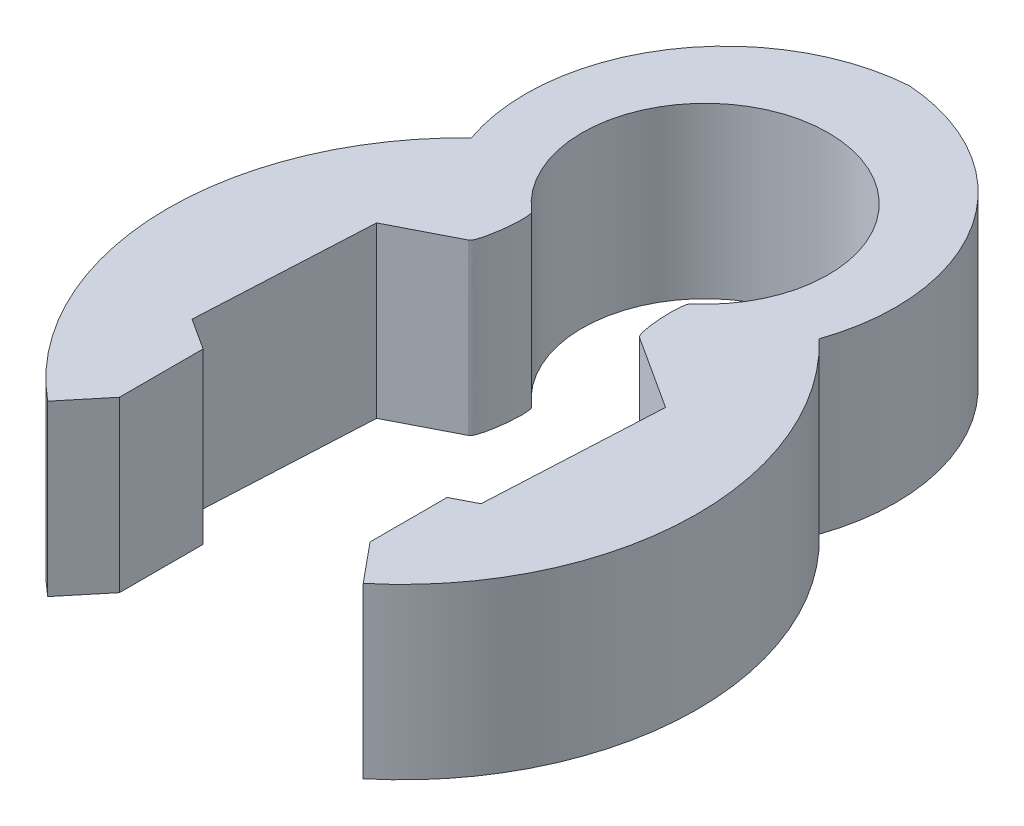
ISO-10303-21;
HEADER;
FILE_DESCRIPTION(('STEP AP214'),'2;1');
FILE_NAME('part.step','',(''),(''),'','','');
FILE_SCHEMA(('AUTOMOTIVE_DESIGN { 1 0 10303 214 1 1 1 1 }'));
ENDSEC;
DATA;
#1=APPLICATION_CONTEXT('core data for automotive mechanical design processes');
#2=APPLICATION_PROTOCOL_DEFINITION('international standard','automotive_design',2000,#1);
#3=PRODUCT_CONTEXT('',#1,'mechanical');
#4=PRODUCT('Part','Part','',(#3));
#5=PRODUCT_RELATED_PRODUCT_CATEGORY('part','',(#4));
#6=PRODUCT_DEFINITION_FORMATION('','',#4);
#7=PRODUCT_DEFINITION_CONTEXT('part definition',#1,'design');
#8=PRODUCT_DEFINITION('design','',#6,#7);
#9=PRODUCT_DEFINITION_SHAPE('','',#8);
#10=(LENGTH_UNIT() NAMED_UNIT(*) SI_UNIT(.MILLI.,.METRE.));
#11=(NAMED_UNIT(*) PLANE_ANGLE_UNIT() SI_UNIT($,.RADIAN.));
#12=(NAMED_UNIT(*) SI_UNIT($,.STERADIAN.) SOLID_ANGLE_UNIT());
#13=UNCERTAINTY_MEASURE_WITH_UNIT(LENGTH_MEASURE(1.E-05),#10,'distance_accuracy_value','');
#14=(GEOMETRIC_REPRESENTATION_CONTEXT(3) GLOBAL_UNCERTAINTY_ASSIGNED_CONTEXT((#13)) GLOBAL_UNIT_ASSIGNED_CONTEXT((#10,
#11,#12)) REPRESENTATION_CONTEXT('',''));
#15=CARTESIAN_POINT('',(0.,0.,0.));
#16=DIRECTION('',(0.,0.,1.));
#17=DIRECTION('',(1.,0.,0.));
#18=AXIS2_PLACEMENT_3D('',#15,#16,#17);
#19=CARTESIAN_POINT('',(-0.598376770378096,6.35,0.494644047014797));
#20=DIRECTION('',(0.770751226655631,0.,-0.637136207265636));
#21=DIRECTION('',(-0.637136207265636,0.,-0.770751226655631));
#22=AXIS2_PLACEMENT_3D('',#19,#20,#21);
#23=PLANE('',#22);
#24=DIRECTION('',(0.637136207265636,0.,0.770751226655631));
#25=VECTOR('',#24,1.);
#26=CARTESIAN_POINT('',(-0.598376770378096,0.,0.494644047014797));
#27=LINE('',#26,#25);
#28=CARTESIAN_POINT('',(4.70120496832042,0.,6.90561093177807));
#29=VERTEX_POINT('',#28);
#30=CARTESIAN_POINT('',(5.9187802535043,0.,8.37852619526394));
#31=VERTEX_POINT('',#30);
#32=EDGE_CURVE('E196',#29,#31,#27,.T.);
#33=ORIENTED_EDGE('',*,*,#32,.T.);
#34=DIRECTION('',(0.,-1.,0.));
#35=VECTOR('',#34,1.);
#36=CARTESIAN_POINT('',(5.9187802535043,6.35,8.37852619526394));
#37=LINE('',#36,#35);
#38=CARTESIAN_POINT('',(5.9187802535043,6.35,8.37852619526394));
#39=VERTEX_POINT('',#38);
#40=EDGE_CURVE('E177',#39,#31,#37,.T.);
#41=ORIENTED_EDGE('',*,*,#40,.F.);
#42=DIRECTION('',(0.637136207265636,0.,0.770751226655631));
#43=VECTOR('',#42,1.);
#44=CARTESIAN_POINT('',(-0.598376770378096,6.35,0.494644047014797));
#45=LINE('',#44,#43);
#46=CARTESIAN_POINT('',(4.70120496832042,6.35,6.90561093177807));
#47=VERTEX_POINT('',#46);
#48=EDGE_CURVE('E183',#47,#39,#45,.T.);
#49=ORIENTED_EDGE('',*,*,#48,.F.);
#50=DIRECTION('',(0.,-1.,0.));
#51=VECTOR('',#50,1.);
#52=CARTESIAN_POINT('',(4.70120496832042,6.35,6.90561093177807));
#53=LINE('',#52,#51);
#54=EDGE_CURVE('E225',#47,#29,#53,.T.);
#55=ORIENTED_EDGE('',*,*,#54,.T.);
#56=EDGE_LOOP('',(#33,#41,#49,#55));
#57=FACE_BOUND('',#56,.T.);
#58=ADVANCED_FACE('F46',(#57),#23,.F.);
#59=CARTESIAN_POINT('',(-1.12456517035275,6.35,-0.141892301269298));
#60=DIRECTION('',(0.,-1.,0.));
#61=DIRECTION('',(0.,0.,-1.));
#62=AXIS2_PLACEMENT_3D('',#59,#60,#61);
#63=CYLINDRICAL_SURFACE('',#62,11.0546933976404);
#64=CARTESIAN_POINT('',(-1.12456517035275,0.,-0.141892301269298));
#65=DIRECTION('',(0.,1.,0.));
#66=DIRECTION('',(0.,0.,1.));
#67=AXIS2_PLACEMENT_3D('',#64,#65,#66);
#68=CIRCLE('',#67,11.0546933976404);
#69=CARTESIAN_POINT('',(6.52662469768185,0.,-8.12096115165017));
#70=VERTEX_POINT('',#69);
#71=EDGE_CURVE('E261',#31,#70,#68,.T.);
#72=ORIENTED_EDGE('',*,*,#71,.T.);
#73=DIRECTION('',(0.,-1.,0.));
#74=VECTOR('',#73,1.);
#75=CARTESIAN_POINT('',(6.52662469768185,6.35,-8.12096115165017));
#76=LINE('',#75,#74);
#77=CARTESIAN_POINT('',(6.52662469768185,6.35,-8.12096115165017));
#78=VERTEX_POINT('',#77);
#79=EDGE_CURVE('E180',#78,#70,#76,.T.);
#80=ORIENTED_EDGE('',*,*,#79,.F.);
#81=CARTESIAN_POINT('',(-1.12456517035275,6.35,-0.141892301269298));
#82=DIRECTION('',(0.,1.,0.));
#83=DIRECTION('',(0.,0.,1.));
#84=AXIS2_PLACEMENT_3D('',#81,#82,#83);
#85=CIRCLE('',#84,11.0546933976404);
#86=EDGE_CURVE('E173',#39,#78,#85,.T.);
#87=ORIENTED_EDGE('',*,*,#86,.F.);
#88=ORIENTED_EDGE('',*,*,#40,.T.);
#89=EDGE_LOOP('',(#72,#80,#87,#88));
#90=FACE_BOUND('',#89,.T.);
#91=ADVANCED_FACE('F175',(#90),#63,.T.);
#92=CARTESIAN_POINT('',(-0.542547571953858,6.35,-10.5725213353697));
#93=DIRECTION('',(0.,-1.,0.));
#94=DIRECTION('',(0.,0.,-1.));
#95=AXIS2_PLACEMENT_3D('',#92,#93,#94);
#96=CYLINDRICAL_SURFACE('',#95,7.48220180910577);
#97=CARTESIAN_POINT('',(-0.542547571953858,0.,-10.5725213353697));
#98=DIRECTION('',(0.,1.,0.));
#99=DIRECTION('',(0.,0.,1.));
#100=AXIS2_PLACEMENT_3D('',#97,#98,#99);
#101=CIRCLE('',#100,7.48220180910577);
#102=CARTESIAN_POINT('',(0.,0.,-18.0350266817231));
#103=VERTEX_POINT('',#102);
#104=EDGE_CURVE('E258',#70,#103,#101,.T.);
#105=ORIENTED_EDGE('',*,*,#104,.T.);
#106=DIRECTION('',(0.,-1.,0.));
#107=VECTOR('',#106,1.);
#108=CARTESIAN_POINT('',(0.,6.35,-18.0350266817231));
#109=LINE('',#108,#107);
#110=CARTESIAN_POINT('',(0.,6.35,-18.0350266817231));
#111=VERTEX_POINT('',#110);
#112=EDGE_CURVE('E201',#111,#103,#109,.T.);
#113=ORIENTED_EDGE('',*,*,#112,.F.);
#114=CARTESIAN_POINT('',(-0.542547571953858,6.35,-10.5725213353697));
#115=DIRECTION('',(0.,1.,0.));
#116=DIRECTION('',(0.,0.,1.));
#117=AXIS2_PLACEMENT_3D('',#114,#115,#116);
#118=CIRCLE('',#117,7.48220180910577);
#119=EDGE_CURVE('E182',#78,#111,#118,.T.);
#120=ORIENTED_EDGE('',*,*,#119,.F.);
#121=ORIENTED_EDGE('',*,*,#79,.T.);
#122=EDGE_LOOP('',(#105,#113,#120,#121));
#123=FACE_BOUND('',#122,.T.);
#124=ADVANCED_FACE('F259',(#123),#96,.T.);
#125=CARTESIAN_POINT('',(0.542547571953858,6.35,-10.5725213353697));
#126=DIRECTION('',(0.,-1.,0.));
#127=DIRECTION('',(0.,0.,-1.));
#128=AXIS2_PLACEMENT_3D('',#125,#126,#127);
#129=CYLINDRICAL_SURFACE('',#128,7.48220180910577);
#130=CARTESIAN_POINT('',(0.542547571953858,0.,-10.5725213353697));
#131=DIRECTION('',(0.,1.,0.));
#132=DIRECTION('',(0.,0.,1.));
#133=AXIS2_PLACEMENT_3D('',#130,#131,#132);
#134=CIRCLE('',#133,7.48220180910577);
#135=CARTESIAN_POINT('',(-6.52662469768186,0.,-8.12096115165017));
#136=VERTEX_POINT('',#135);
#137=EDGE_CURVE('E252',#136,#103,#134,.F.);
#138=ORIENTED_EDGE('',*,*,#137,.F.);
#139=DIRECTION('',(0.,-1.,0.));
#140=VECTOR('',#139,1.);
#141=CARTESIAN_POINT('',(-6.52662469768186,6.35,-8.12096115165017));
#142=LINE('',#141,#140);
#143=CARTESIAN_POINT('',(-6.52662469768186,6.35,-8.12096115165017));
#144=VERTEX_POINT('',#143);
#145=EDGE_CURVE('E244',#144,#136,#142,.T.);
#146=ORIENTED_EDGE('',*,*,#145,.F.);
#147=CARTESIAN_POINT('',(0.542547571953858,6.35,-10.5725213353697));
#148=DIRECTION('',(0.,1.,0.));
#149=DIRECTION('',(0.,0.,1.));
#150=AXIS2_PLACEMENT_3D('',#147,#148,#149);
#151=CIRCLE('',#150,7.48220180910577);
#152=EDGE_CURVE('E255',#144,#111,#151,.F.);
#153=ORIENTED_EDGE('',*,*,#152,.T.);
#154=ORIENTED_EDGE('',*,*,#112,.T.);
#155=EDGE_LOOP('',(#138,#146,#153,#154));
#156=FACE_BOUND('',#155,.T.);
#157=ADVANCED_FACE('F250',(#156),#129,.T.);
#158=CARTESIAN_POINT('',(1.12456517035275,6.35,-0.141892301269298));
#159=DIRECTION('',(0.,-1.,0.));
#160=DIRECTION('',(0.,0.,-1.));
#161=AXIS2_PLACEMENT_3D('',#158,#159,#160);
#162=CYLINDRICAL_SURFACE('',#161,11.0546933976404);
#163=CARTESIAN_POINT('',(1.12456517035275,0.,-0.141892301269298));
#164=DIRECTION('',(0.,1.,0.));
#165=DIRECTION('',(0.,0.,1.));
#166=AXIS2_PLACEMENT_3D('',#163,#164,#165);
#167=CIRCLE('',#166,11.0546933976404);
#168=CARTESIAN_POINT('',(-5.91878025350429,0.,8.37852619526395));
#169=VERTEX_POINT('',#168);
#170=EDGE_CURVE('E266',#169,#136,#167,.F.);
#171=ORIENTED_EDGE('',*,*,#170,.F.);
#172=DIRECTION('',(0.,-1.,0.));
#173=VECTOR('',#172,1.);
#174=CARTESIAN_POINT('',(-5.91878025350429,6.35,8.37852619526395));
#175=LINE('',#174,#173);
#176=CARTESIAN_POINT('',(-5.91878025350429,6.35,8.37852619526395));
#177=VERTEX_POINT('',#176);
#178=EDGE_CURVE('E242',#177,#169,#175,.T.);
#179=ORIENTED_EDGE('',*,*,#178,.F.);
#180=CARTESIAN_POINT('',(1.12456517035275,6.35,-0.141892301269298));
#181=DIRECTION('',(0.,1.,0.));
#182=DIRECTION('',(0.,0.,1.));
#183=AXIS2_PLACEMENT_3D('',#180,#181,#182);
#184=CIRCLE('',#183,11.0546933976404);
#185=EDGE_CURVE('E546',#177,#144,#184,.F.);
#186=ORIENTED_EDGE('',*,*,#185,.T.);
#187=ORIENTED_EDGE('',*,*,#145,.T.);
#188=EDGE_LOOP('',(#171,#179,#186,#187));
#189=FACE_BOUND('',#188,.T.);
#190=ADVANCED_FACE('F507',(#189),#162,.T.);
#191=CARTESIAN_POINT('',(0.598376770378092,6.35,0.494644047014792));
#192=DIRECTION('',(0.770751226655632,0.,0.637136207265635));
#193=DIRECTION('',(0.637136207265635,0.,-0.770751226655632));
#194=AXIS2_PLACEMENT_3D('',#191,#192,#193);
#195=PLANE('',#194);
#196=DIRECTION('',(-0.637136207265635,0.,0.770751226655632));
#197=VECTOR('',#196,1.);
#198=CARTESIAN_POINT('',(0.598376770378092,0.,0.494644047014792));
#199=LINE('',#198,#197);
#200=CARTESIAN_POINT('',(-4.70120496832041,0.,6.90561093177807));
#201=VERTEX_POINT('',#200);
#202=EDGE_CURVE('E268',#201,#169,#199,.T.);
#203=ORIENTED_EDGE('',*,*,#202,.F.);
#204=DIRECTION('',(0.,-1.,0.));
#205=VECTOR('',#204,1.);
#206=CARTESIAN_POINT('',(-4.70120496832041,6.35,6.90561093177807));
#207=LINE('',#206,#205);
#208=CARTESIAN_POINT('',(-4.70120496832041,6.35,6.90561093177807));
#209=VERTEX_POINT('',#208);
#210=EDGE_CURVE('E240',#209,#201,#207,.T.);
#211=ORIENTED_EDGE('',*,*,#210,.F.);
#212=DIRECTION('',(-0.637136207265635,0.,0.770751226655632));
#213=VECTOR('',#212,1.);
#214=CARTESIAN_POINT('',(0.598376770378092,6.35,0.494644047014792));
#215=LINE('',#214,#213);
#216=EDGE_CURVE('E543',#209,#177,#215,.T.);
#217=ORIENTED_EDGE('',*,*,#216,.T.);
#218=ORIENTED_EDGE('',*,*,#178,.T.);
#219=EDGE_LOOP('',(#203,#211,#217,#218));
#220=FACE_BOUND('',#219,.T.);
#221=ADVANCED_FACE('F510',(#220),#195,.T.);
#222=CARTESIAN_POINT('',(-4.70120496832042,6.35,0.));
#223=DIRECTION('',(1.,0.,0.));
#224=DIRECTION('',(0.,0.,-1.));
#225=AXIS2_PLACEMENT_3D('',#222,#223,#224);
#226=PLANE('',#225);
#227=DIRECTION('',(0.,0.,1.));
#228=VECTOR('',#227,1.);
#229=CARTESIAN_POINT('',(-4.70120496832042,0.,0.));
#230=LINE('',#229,#228);
#231=CARTESIAN_POINT('',(-4.70120496832042,0.,3.76579802688678));
#232=VERTEX_POINT('',#231);
#233=EDGE_CURVE('E273',#232,#201,#230,.T.);
#234=ORIENTED_EDGE('',*,*,#233,.F.);
#235=DIRECTION('',(0.,-1.,0.));
#236=VECTOR('',#235,1.);
#237=CARTESIAN_POINT('',(-4.70120496832042,6.35,3.76579802688678));
#238=LINE('',#237,#236);
#239=CARTESIAN_POINT('',(-4.70120496832042,6.35,3.76579802688678));
#240=VERTEX_POINT('',#239);
#241=EDGE_CURVE('E238',#240,#232,#238,.T.);
#242=ORIENTED_EDGE('',*,*,#241,.F.);
#243=DIRECTION('',(0.,0.,1.));
#244=VECTOR('',#243,1.);
#245=CARTESIAN_POINT('',(-4.70120496832042,6.35,0.));
#246=LINE('',#245,#244);
#247=EDGE_CURVE('E538',#240,#209,#246,.T.);
#248=ORIENTED_EDGE('',*,*,#247,.T.);
#249=ORIENTED_EDGE('',*,*,#210,.T.);
#250=EDGE_LOOP('',(#234,#242,#248,#249));
#251=FACE_BOUND('',#250,.T.);
#252=ADVANCED_FACE('F514',(#251),#226,.T.);
#253=CARTESIAN_POINT('',(-3.10319954031292,6.35,4.7991017506406));
#254=DIRECTION('',(0.542992045549067,0.,-0.839737839132214));
#255=DIRECTION('',(-0.839737839132214,0.,-0.542992045549067));
#256=AXIS2_PLACEMENT_3D('',#253,#254,#255);
#257=PLANE('',#256);
#258=DIRECTION('',(0.839737839132214,0.,0.542992045549067));
#259=VECTOR('',#258,1.);
#260=CARTESIAN_POINT('',(-3.10319954031292,0.,4.7991017506406));
#261=LINE('',#260,#259);
#262=CARTESIAN_POINT('',(-5.87396222791367,0.,3.00746866069182));
#263=VERTEX_POINT('',#262);
#264=EDGE_CURVE('E276',#263,#232,#261,.T.);
#265=ORIENTED_EDGE('',*,*,#264,.F.);
#266=DIRECTION('',(0.,-1.,0.));
#267=VECTOR('',#266,1.);
#268=CARTESIAN_POINT('',(-5.87396222791367,6.35,3.00746866069182));
#269=LINE('',#268,#267);
#270=CARTESIAN_POINT('',(-5.87396222791367,6.35,3.00746866069182));
#271=VERTEX_POINT('',#270);
#272=EDGE_CURVE('E236',#271,#263,#269,.T.);
#273=ORIENTED_EDGE('',*,*,#272,.F.);
#274=DIRECTION('',(0.839737839132214,0.,0.542992045549067));
#275=VECTOR('',#274,1.);
#276=CARTESIAN_POINT('',(-3.10319954031292,6.35,4.7991017506406));
#277=LINE('',#276,#275);
#278=EDGE_CURVE('E537',#271,#240,#277,.T.);
#279=ORIENTED_EDGE('',*,*,#278,.T.);
#280=ORIENTED_EDGE('',*,*,#241,.T.);
#281=EDGE_LOOP('',(#265,#273,#279,#280));
#282=FACE_BOUND('',#281,.T.);
#283=ADVANCED_FACE('F518',(#282),#257,.T.);
#284=CARTESIAN_POINT('',(-5.70774380155759,6.35,-0.287898759602873));
#285=DIRECTION('',(0.998730323982081,0.,0.0503759859322613));
#286=DIRECTION('',(0.0503759859322613,0.,-0.998730323982081));
#287=AXIS2_PLACEMENT_3D('',#284,#285,#286);
#288=PLANE('',#287);
#289=DIRECTION('',(-0.0503759859322613,0.,0.998730323982081));
#290=VECTOR('',#289,1.);
#291=CARTESIAN_POINT('',(-5.70774380155759,0.,-0.287898759602873));
#292=LINE('',#291,#290);
#293=CARTESIAN_POINT('',(-5.54152537520151,0.,-3.58326617989757));
#294=VERTEX_POINT('',#293);
#295=EDGE_CURVE('E279',#294,#263,#292,.T.);
#296=ORIENTED_EDGE('',*,*,#295,.F.);
#297=DIRECTION('',(0.,-1.,0.));
#298=VECTOR('',#297,1.);
#299=CARTESIAN_POINT('',(-5.54152537520151,6.35,-3.58326617989757));
#300=LINE('',#299,#298);
#301=CARTESIAN_POINT('',(-5.54152537520151,6.35,-3.58326617989757));
#302=VERTEX_POINT('',#301);
#303=EDGE_CURVE('E233',#302,#294,#300,.T.);
#304=ORIENTED_EDGE('',*,*,#303,.F.);
#305=DIRECTION('',(-0.0503759859322613,0.,0.998730323982081));
#306=VECTOR('',#305,1.);
#307=CARTESIAN_POINT('',(-5.70774380155759,6.35,-0.287898759602873));
#308=LINE('',#307,#306);
#309=EDGE_CURVE('E388',#302,#271,#308,.T.);
#310=ORIENTED_EDGE('',*,*,#309,.T.);
#311=ORIENTED_EDGE('',*,*,#272,.T.);
#312=EDGE_LOOP('',(#296,#304,#310,#311));
#313=FACE_BOUND('',#312,.T.);
#314=ADVANCED_FACE('F521',(#313),#288,.T.);
#315=CARTESIAN_POINT('',(-2.60454426124468,6.35,-5.08700051024348));
#316=DIRECTION('',(0.455738278433015,0.,0.890113825064476));
#317=DIRECTION('',(0.890113825064476,0.,-0.455738278433015));
#318=AXIS2_PLACEMENT_3D('',#315,#316,#317);
#319=PLANE('',#318);
#320=DIRECTION('',(-0.890113825064476,0.,0.455738278433015));
#321=VECTOR('',#320,1.);
#322=CARTESIAN_POINT('',(-2.60454426124468,0.,-5.08700051024348));
#323=LINE('',#322,#321);
#324=CARTESIAN_POINT('',(-3.24270927997033,0.,-4.76026002065594));
#325=VERTEX_POINT('',#324);
#326=EDGE_CURVE('E281',#325,#294,#323,.T.);
#327=ORIENTED_EDGE('',*,*,#326,.F.);
#328=CARTESIAN_POINT('',(-3.24270927997033,6.6675,-4.76026002065594));
#329=CARTESIAN_POINT('',(-3.24270927997033,4.33916666666666,-4.76026002065594));
#330=CARTESIAN_POINT('',(-3.24270927997033,2.01083333333333,-4.76026002065594));
#331=CARTESIAN_POINT('',(-3.24270927997033,-0.317499999999999,-4.76026002065594));
#332=(BOUNDED_CURVE() B_SPLINE_CURVE(3,(#328,#329,#330,#331),.UNSPECIFIED.,.F.,
.F.) B_SPLINE_CURVE_WITH_KNOTS((4,4),(-0.0003175,0.0066675),
.UNSPECIFIED.) CURVE() GEOMETRIC_REPRESENTATION_ITEM() RATIONAL_B_SPLINE_CURVE((1.,1.,1.,1.)) REPRESENTATION_ITEM(''));
#333=CARTESIAN_POINT('',(-3.24270927997033,6.35,-4.76026002065594));
#334=VERTEX_POINT('',#333);
#335=EDGE_CURVE('E12',#325,#334,#332,.F.);
#336=ORIENTED_EDGE('',*,*,#335,.T.);
#337=DIRECTION('',(-0.890113825064476,0.,0.455738278433015));
#338=VECTOR('',#337,1.);
#339=CARTESIAN_POINT('',(-2.60454426124468,6.35,-5.08700051024348));
#340=LINE('',#339,#338);
#341=EDGE_CURVE('E319',#334,#302,#340,.T.);
#342=ORIENTED_EDGE('',*,*,#341,.T.);
#343=ORIENTED_EDGE('',*,*,#303,.T.);
#344=EDGE_LOOP('',(#327,#336,#342,#343));
#345=FACE_BOUND('',#344,.T.);
#346=ADVANCED_FACE('F371',(#345),#319,.T.);
#347=CARTESIAN_POINT('',(0.,6.35,-10.3692276538807));
#348=DIRECTION('',(0.,-1.,0.));
#349=DIRECTION('',(0.,0.,-1.));
#350=AXIS2_PLACEMENT_3D('',#347,#348,#349);
#351=CYLINDRICAL_SURFACE('',#350,4.61735997238747);
#352=CARTESIAN_POINT('',(0.,0.,-10.3692276538807));
#353=DIRECTION('',(0.,1.,0.));
#354=DIRECTION('',(0.,0.,1.));
#355=AXIS2_PLACEMENT_3D('',#352,#353,#354);
#356=CIRCLE('',#355,4.61735997238747);
#357=CARTESIAN_POINT('',(2.97420564902517,0.,-6.83735649656018));
#358=VERTEX_POINT('',#357);
#359=CARTESIAN_POINT('',(-2.99713740518315,0.,-6.85679537851113));
#360=VERTEX_POINT('',#359);
#361=EDGE_CURVE('E210',#358,#360,#356,.T.);
#362=ORIENTED_EDGE('',*,*,#361,.F.);
#363=CARTESIAN_POINT('',(2.97420564902517,6.6675,-6.83735649656018));
#364=CARTESIAN_POINT('',(2.97420564902517,4.33916666666666,-6.83735649656018));
#365=CARTESIAN_POINT('',(2.97420564902517,2.01083333333333,-6.83735649656018));
#366=CARTESIAN_POINT('',(2.97420564902517,-0.317499999999999,-6.83735649656018));
#367=(BOUNDED_CURVE() B_SPLINE_CURVE(3,(#363,#364,#365,#366),.UNSPECIFIED.,.F.,
.F.) B_SPLINE_CURVE_WITH_KNOTS((4,4),(-0.0003175,0.0066675),
.UNSPECIFIED.) CURVE() GEOMETRIC_REPRESENTATION_ITEM() RATIONAL_B_SPLINE_CURVE((1.,1.,1.,1.)) REPRESENTATION_ITEM(''));
#368=CARTESIAN_POINT('',(2.97420564902517,6.35,-6.83735649656018));
#369=VERTEX_POINT('',#368);
#370=EDGE_CURVE('E455',#358,#369,#367,.F.);
#371=ORIENTED_EDGE('',*,*,#370,.T.);
#372=CARTESIAN_POINT('',(0.,6.35,-10.3692276538807));
#373=DIRECTION('',(0.,1.,0.));
#374=DIRECTION('',(0.,0.,1.));
#375=AXIS2_PLACEMENT_3D('',#372,#373,#374);
#376=CIRCLE('',#375,4.61735997238747);
#377=CARTESIAN_POINT('',(-2.99713740518315,6.35,-6.85679537851113));
#378=VERTEX_POINT('',#377);
#379=EDGE_CURVE('E311',#369,#378,#376,.T.);
#380=ORIENTED_EDGE('',*,*,#379,.T.);
#381=CARTESIAN_POINT('',(-2.99713740518315,-0.317499999999999,-6.85679537851113));
#382=CARTESIAN_POINT('',(-2.99713740518315,2.01083333333333,-6.85679537851113));
#383=CARTESIAN_POINT('',(-2.99713740518315,4.33916666666666,-6.85679537851113));
#384=CARTESIAN_POINT('',(-2.99713740518315,6.6675,-6.85679537851113));
#385=(BOUNDED_CURVE() B_SPLINE_CURVE(3,(#381,#382,#383,#384),.UNSPECIFIED.,.F.,
.F.) B_SPLINE_CURVE_WITH_KNOTS((4,4),(-0.0003175,0.0066675),
.UNSPECIFIED.) CURVE() GEOMETRIC_REPRESENTATION_ITEM() RATIONAL_B_SPLINE_CURVE((1.,1.,1.,1.)) REPRESENTATION_ITEM(''));
#386=EDGE_CURVE('E476',#378,#360,#385,.F.);
#387=ORIENTED_EDGE('',*,*,#386,.T.);
#388=EDGE_LOOP('',(#362,#371,#380,#387));
#389=FACE_BOUND('',#388,.T.);
#390=ADVANCED_FACE('F367',(#389),#351,.F.);
#391=CARTESIAN_POINT('',(3.10319954031291,6.35,-4.79910175064061));
#392=DIRECTION('',(-0.542992045549066,0.,0.839737839132214));
#393=DIRECTION('',(0.839737839132214,0.,0.542992045549066));
#394=AXIS2_PLACEMENT_3D('',#391,#392,#393);
#395=PLANE('',#394);
#396=DIRECTION('',(-0.839737839132214,0.,-0.542992045549066));
#397=VECTOR('',#396,1.);
#398=CARTESIAN_POINT('',(3.10319954031291,6.35,-4.79910175064061));
#399=LINE('',#398,#397);
#400=CARTESIAN_POINT('',(5.87396222791367,6.35,-3.00746866069182));
#401=VERTEX_POINT('',#400);
#402=CARTESIAN_POINT('',(3.10265788418253,6.35,-4.79945199682044));
#403=VERTEX_POINT('',#402);
#404=EDGE_CURVE('E211',#401,#403,#399,.T.);
#405=ORIENTED_EDGE('',*,*,#404,.T.);
#406=CARTESIAN_POINT('',(3.10265788418253,-0.317499999999999,-4.79945199682044));
#407=CARTESIAN_POINT('',(3.10265788418253,2.01083333333333,-4.79945199682044));
#408=CARTESIAN_POINT('',(3.10265788418253,4.33916666666666,-4.79945199682044));
#409=CARTESIAN_POINT('',(3.10265788418253,6.6675,-4.79945199682044));
#410=(BOUNDED_CURVE() B_SPLINE_CURVE(3,(#406,#407,#408,#409),.UNSPECIFIED.,.F.,
.F.) B_SPLINE_CURVE_WITH_KNOTS((4,4),(-0.0003175,0.0066675),
.UNSPECIFIED.) CURVE() GEOMETRIC_REPRESENTATION_ITEM() RATIONAL_B_SPLINE_CURVE((1.,1.,1.,1.)) REPRESENTATION_ITEM(''));
#411=CARTESIAN_POINT('',(3.10265788418253,0.,-4.79945199682044));
#412=VERTEX_POINT('',#411);
#413=EDGE_CURVE('E197',#403,#412,#410,.F.);
#414=ORIENTED_EDGE('',*,*,#413,.T.);
#415=DIRECTION('',(-0.839737839132214,0.,-0.542992045549066));
#416=VECTOR('',#415,1.);
#417=CARTESIAN_POINT('',(3.10319954031291,0.,-4.79910175064061));
#418=LINE('',#417,#416);
#419=CARTESIAN_POINT('',(5.87396222791367,0.,-3.00746866069182));
#420=VERTEX_POINT('',#419);
#421=EDGE_CURVE('E205',#420,#412,#418,.T.);
#422=ORIENTED_EDGE('',*,*,#421,.F.);
#423=DIRECTION('',(0.,-1.,0.));
#424=VECTOR('',#423,1.);
#425=CARTESIAN_POINT('',(5.87396222791367,6.35,-3.00746866069182));
#426=LINE('',#425,#424);
#427=EDGE_CURVE('E231',#401,#420,#426,.T.);
#428=ORIENTED_EDGE('',*,*,#427,.F.);
#429=EDGE_LOOP('',(#405,#414,#422,#428));
#430=FACE_BOUND('',#429,.T.);
#431=ADVANCED_FACE('F349',(#430),#395,.T.);
#432=CARTESIAN_POINT('',(5.70774380155759,6.35,0.287898759602873));
#433=DIRECTION('',(-0.998730323982081,0.,-0.0503759859322612));
#434=DIRECTION('',(-0.0503759859322612,0.,0.998730323982081));
#435=AXIS2_PLACEMENT_3D('',#432,#433,#434);
#436=PLANE('',#435);
#437=DIRECTION('',(0.0503759859322612,0.,-0.998730323982081));
#438=VECTOR('',#437,1.);
#439=CARTESIAN_POINT('',(5.70774380155759,0.,0.287898759602873));
#440=LINE('',#439,#438);
#441=CARTESIAN_POINT('',(5.54152537520151,0.,3.58326617989757));
#442=VERTEX_POINT('',#441);
#443=EDGE_CURVE('E209',#442,#420,#440,.T.);
#444=ORIENTED_EDGE('',*,*,#443,.F.);
#445=DIRECTION('',(0.,-1.,0.));
#446=VECTOR('',#445,1.);
#447=CARTESIAN_POINT('',(5.54152537520151,6.35,3.58326617989757));
#448=LINE('',#447,#446);
#449=CARTESIAN_POINT('',(5.54152537520151,6.35,3.58326617989757));
#450=VERTEX_POINT('',#449);
#451=EDGE_CURVE('E229',#450,#442,#448,.T.);
#452=ORIENTED_EDGE('',*,*,#451,.F.);
#453=DIRECTION('',(0.0503759859322612,0.,-0.998730323982081));
#454=VECTOR('',#453,1.);
#455=CARTESIAN_POINT('',(5.70774380155759,6.35,0.287898759602873));
#456=LINE('',#455,#454);
#457=EDGE_CURVE('E328',#450,#401,#456,.T.);
#458=ORIENTED_EDGE('',*,*,#457,.T.);
#459=ORIENTED_EDGE('',*,*,#427,.T.);
#460=EDGE_LOOP('',(#444,#452,#458,#459));
#461=FACE_BOUND('',#460,.T.);
#462=ADVANCED_FACE('F343',(#461),#436,.T.);
#463=CARTESIAN_POINT('',(2.60454426124468,6.35,5.08700051024348));
#464=DIRECTION('',(-0.455738278433015,0.,-0.890113825064475));
#465=DIRECTION('',(-0.890113825064476,0.,0.455738278433015));
#466=AXIS2_PLACEMENT_3D('',#463,#464,#465);
#467=PLANE('',#466);
#468=DIRECTION('',(0.890113825064476,0.,-0.455738278433015));
#469=VECTOR('',#468,1.);
#470=CARTESIAN_POINT('',(2.60454426124468,0.,5.08700051024348));
#471=LINE('',#470,#469);
#472=CARTESIAN_POINT('',(4.70120496832042,0.,4.01351022822069));
#473=VERTEX_POINT('',#472);
#474=EDGE_CURVE('E221',#473,#442,#471,.T.);
#475=ORIENTED_EDGE('',*,*,#474,.F.);
#476=DIRECTION('',(0.,-1.,0.));
#477=VECTOR('',#476,1.);
#478=CARTESIAN_POINT('',(4.70120496832042,6.35,4.01351022822069));
#479=LINE('',#478,#477);
#480=CARTESIAN_POINT('',(4.70120496832042,6.35,4.01351022822069));
#481=VERTEX_POINT('',#480);
#482=EDGE_CURVE('E227',#481,#473,#479,.T.);
#483=ORIENTED_EDGE('',*,*,#482,.F.);
#484=DIRECTION('',(0.890113825064476,0.,-0.455738278433015));
#485=VECTOR('',#484,1.);
#486=CARTESIAN_POINT('',(2.60454426124468,6.35,5.08700051024348));
#487=LINE('',#486,#485);
#488=EDGE_CURVE('E331',#481,#450,#487,.T.);
#489=ORIENTED_EDGE('',*,*,#488,.T.);
#490=ORIENTED_EDGE('',*,*,#451,.T.);
#491=EDGE_LOOP('',(#475,#483,#489,#490));
#492=FACE_BOUND('',#491,.T.);
#493=ADVANCED_FACE('F339',(#492),#467,.T.);
#494=CARTESIAN_POINT('',(4.70120496832042,6.35,0.));
#495=DIRECTION('',(1.,0.,0.));
#496=DIRECTION('',(0.,0.,-1.));
#497=AXIS2_PLACEMENT_3D('',#494,#495,#496);
#498=PLANE('',#497);
#499=DIRECTION('',(0.,0.,1.));
#500=VECTOR('',#499,1.);
#501=CARTESIAN_POINT('',(4.70120496832042,0.,0.));
#502=LINE('',#501,#500);
#503=EDGE_CURVE('E193',#473,#29,#502,.T.);
#504=ORIENTED_EDGE('',*,*,#503,.T.);
#505=ORIENTED_EDGE('',*,*,#54,.F.);
#506=DIRECTION('',(0.,0.,1.));
#507=VECTOR('',#506,1.);
#508=CARTESIAN_POINT('',(4.70120496832042,6.35,0.));
#509=LINE('',#508,#507);
#510=EDGE_CURVE('E189',#481,#47,#509,.T.);
#511=ORIENTED_EDGE('',*,*,#510,.F.);
#512=ORIENTED_EDGE('',*,*,#482,.T.);
#513=EDGE_LOOP('',(#504,#505,#511,#512));
#514=FACE_BOUND('',#513,.T.);
#515=ADVANCED_FACE('F305',(#514),#498,.F.);
#516=CARTESIAN_POINT('',(0.,6.35,0.));
#517=DIRECTION('',(0.,1.,0.));
#518=DIRECTION('',(0.,0.,1.));
#519=AXIS2_PLACEMENT_3D('',#516,#517,#518);
#520=PLANE('',#519);
#521=ORIENTED_EDGE('',*,*,#379,.F.);
#522=CARTESIAN_POINT('',(3.10265788418253,6.35,-4.79945199682044));
#523=CARTESIAN_POINT('',(1.66110640734555,6.35,-5.73158932432362));
#524=CARTESIAN_POINT('',(2.97420564902517,6.35,-6.83735649656017));
#525=(BOUNDED_CURVE() B_SPLINE_CURVE(2,(#522,#523,#524),.UNSPECIFIED.,.F.,
.F.) B_SPLINE_CURVE_WITH_KNOTS((3,3),(0.,1.),
.UNSPECIFIED.) CURVE() GEOMETRIC_REPRESENTATION_ITEM() RATIONAL_B_SPLINE_CURVE((1.,
0.118948345896042,1.)) REPRESENTATION_ITEM(''));
#526=EDGE_CURVE('E60',#369,#403,#525,.F.);
#527=ORIENTED_EDGE('',*,*,#526,.T.);
#528=ORIENTED_EDGE('',*,*,#404,.F.);
#529=ORIENTED_EDGE('',*,*,#457,.F.);
#530=ORIENTED_EDGE('',*,*,#488,.F.);
#531=ORIENTED_EDGE('',*,*,#510,.T.);
#532=ORIENTED_EDGE('',*,*,#48,.T.);
#533=ORIENTED_EDGE('',*,*,#86,.T.);
#534=ORIENTED_EDGE('',*,*,#119,.T.);
#535=ORIENTED_EDGE('',*,*,#152,.F.);
#536=ORIENTED_EDGE('',*,*,#185,.F.);
#537=ORIENTED_EDGE('',*,*,#216,.F.);
#538=ORIENTED_EDGE('',*,*,#247,.F.);
#539=ORIENTED_EDGE('',*,*,#278,.F.);
#540=ORIENTED_EDGE('',*,*,#309,.F.);
#541=ORIENTED_EDGE('',*,*,#341,.F.);
#542=CARTESIAN_POINT('',(-2.99713740518315,6.35,-6.85679537851113));
#543=CARTESIAN_POINT('',(-1.55363692098566,6.35,-5.6250650684561));
#544=CARTESIAN_POINT('',(-3.24270927997033,6.35,-4.76026002065594));
#545=(BOUNDED_CURVE() B_SPLINE_CURVE(2,(#542,#543,#544),.UNSPECIFIED.,.F.,
.F.) B_SPLINE_CURVE_WITH_KNOTS((3,3),(0.,1.),
.UNSPECIFIED.) CURVE() GEOMETRIC_REPRESENTATION_ITEM() RATIONAL_B_SPLINE_CURVE((1.,
0.111239360045646,1.)) REPRESENTATION_ITEM(''));
#546=EDGE_CURVE('E73',#334,#378,#545,.F.);
#547=ORIENTED_EDGE('',*,*,#546,.T.);
#548=EDGE_LOOP('',(#521,#527,#528,#529,#530,#531,#532,#533,#534,#535,#536,#537,#538,#539,#540,
#541,#547));
#549=FACE_BOUND('',#548,.T.);
#550=ADVANCED_FACE('F186',(#549),#520,.T.);
#551=CARTESIAN_POINT('',(0.,0.,0.));
#552=DIRECTION('',(0.,1.,0.));
#553=DIRECTION('',(0.,0.,1.));
#554=AXIS2_PLACEMENT_3D('',#551,#552,#553);
#555=PLANE('',#554);
#556=ORIENTED_EDGE('',*,*,#421,.T.);
#557=CARTESIAN_POINT('',(2.97420564902517,0.,-6.83735649656018));
#558=CARTESIAN_POINT('',(1.66110640734555,0.,-5.73158932432362));
#559=CARTESIAN_POINT('',(3.10265788418253,0.,-4.79945199682044));
#560=(BOUNDED_CURVE() B_SPLINE_CURVE(2,(#557,#558,#559),.UNSPECIFIED.,.F.,
.F.) B_SPLINE_CURVE_WITH_KNOTS((3,3),(0.,1.),
.UNSPECIFIED.) CURVE() GEOMETRIC_REPRESENTATION_ITEM() RATIONAL_B_SPLINE_CURVE((1.,
0.118948345896042,1.)) REPRESENTATION_ITEM(''));
#561=EDGE_CURVE('E345',#412,#358,#560,.F.);
#562=ORIENTED_EDGE('',*,*,#561,.T.);
#563=ORIENTED_EDGE('',*,*,#361,.T.);
#564=CARTESIAN_POINT('',(-3.24270927997033,0.,-4.76026002065594));
#565=CARTESIAN_POINT('',(-1.55363692098566,0.,-5.6250650684561));
#566=CARTESIAN_POINT('',(-2.99713740518315,0.,-6.85679537851113));
#567=(BOUNDED_CURVE() B_SPLINE_CURVE(2,(#564,#565,#566),.UNSPECIFIED.,.F.,
.F.) B_SPLINE_CURVE_WITH_KNOTS((3,3),(0.,1.),
.UNSPECIFIED.) CURVE() GEOMETRIC_REPRESENTATION_ITEM() RATIONAL_B_SPLINE_CURVE((1.,
0.111239360045646,1.)) REPRESENTATION_ITEM(''));
#568=EDGE_CURVE('E200',#360,#325,#567,.F.);
#569=ORIENTED_EDGE('',*,*,#568,.T.);
#570=ORIENTED_EDGE('',*,*,#326,.T.);
#571=ORIENTED_EDGE('',*,*,#295,.T.);
#572=ORIENTED_EDGE('',*,*,#264,.T.);
#573=ORIENTED_EDGE('',*,*,#233,.T.);
#574=ORIENTED_EDGE('',*,*,#202,.T.);
#575=ORIENTED_EDGE('',*,*,#170,.T.);
#576=ORIENTED_EDGE('',*,*,#137,.T.);
#577=ORIENTED_EDGE('',*,*,#104,.F.);
#578=ORIENTED_EDGE('',*,*,#71,.F.);
#579=ORIENTED_EDGE('',*,*,#32,.F.);
#580=ORIENTED_EDGE('',*,*,#503,.F.);
#581=ORIENTED_EDGE('',*,*,#474,.T.);
#582=ORIENTED_EDGE('',*,*,#443,.T.);
#583=EDGE_LOOP('',(#556,#562,#563,#569,#570,#571,#572,#573,#574,#575,#576,#577,#578,#579,#580,
#581,#582));
#584=FACE_BOUND('',#583,.T.);
#585=ADVANCED_FACE('F263',(#584),#555,.F.);
#586=CARTESIAN_POINT('',(3.10265788418253,6.6675,-4.79945199682044));
#587=CARTESIAN_POINT('',(3.10265788418253,4.33916666666666,-4.79945199682044));
#588=CARTESIAN_POINT('',(3.10265788418253,2.01083333333333,-4.79945199682044));
#589=CARTESIAN_POINT('',(3.10265788418253,-0.317499999999999,-4.79945199682044));
#590=CARTESIAN_POINT('',(1.66110640734555,6.6675,-5.73158932432362));
#591=CARTESIAN_POINT('',(1.66110640734555,4.33916666666666,-5.73158932432362));
#592=CARTESIAN_POINT('',(1.66110640734555,2.01083333333333,-5.73158932432362));
#593=CARTESIAN_POINT('',(1.66110640734555,-0.317499999999999,-5.73158932432362));
#594=CARTESIAN_POINT('',(2.97420564902517,6.6675,-6.83735649656018));
#595=CARTESIAN_POINT('',(2.97420564902517,4.33916666666666,-6.83735649656018));
#596=CARTESIAN_POINT('',(2.97420564902517,2.01083333333333,-6.83735649656018));
#597=CARTESIAN_POINT('',(2.97420564902517,-0.317499999999999,-6.83735649656018));
#598=(BOUNDED_SURFACE() B_SPLINE_SURFACE(2,3,((#586,#587,#588,#589),(#590,#591,#592,#593),(#594,
#595,#596,#597)),.UNSPECIFIED.,.F.,.F.,.F.) B_SPLINE_SURFACE_WITH_KNOTS((3,3),(4,4),(0.,1.),
(-0.0003175,0.0066675),
.UNSPECIFIED.) GEOMETRIC_REPRESENTATION_ITEM() RATIONAL_B_SPLINE_SURFACE(((1.,1.,1.,1.),
(0.118948345896042,0.118948345896042,0.118948345896042,0.118948345896042),(1.,1.,1.,1.))) REPRESENTATION_ITEM('') SURFACE());
#599=ORIENTED_EDGE('',*,*,#526,.F.);
#600=ORIENTED_EDGE('',*,*,#370,.F.);
#601=ORIENTED_EDGE('',*,*,#561,.F.);
#602=ORIENTED_EDGE('',*,*,#413,.F.);
#603=EDGE_LOOP('',(#599,#600,#601,#602));
#604=FACE_BOUND('',#603,.T.);
#605=ADVANCED_FACE('F303',(#604),#598,.T.);
#606=CARTESIAN_POINT('',(-2.99713740518315,6.6675,-6.85679537851113));
#607=CARTESIAN_POINT('',(-2.99713740518315,4.33916666666666,-6.85679537851113));
#608=CARTESIAN_POINT('',(-2.99713740518315,2.01083333333333,-6.85679537851113));
#609=CARTESIAN_POINT('',(-2.99713740518315,-0.317499999999999,-6.85679537851113));
#610=CARTESIAN_POINT('',(-1.55363692098566,6.6675,-5.6250650684561));
#611=CARTESIAN_POINT('',(-1.55363692098566,4.33916666666666,-5.6250650684561));
#612=CARTESIAN_POINT('',(-1.55363692098566,2.01083333333334,-5.6250650684561));
#613=CARTESIAN_POINT('',(-1.55363692098566,-0.317499999999999,-5.6250650684561));
#614=CARTESIAN_POINT('',(-3.24270927997033,6.6675,-4.76026002065594));
#615=CARTESIAN_POINT('',(-3.24270927997033,4.33916666666666,-4.76026002065594));
#616=CARTESIAN_POINT('',(-3.24270927997033,2.01083333333333,-4.76026002065594));
#617=CARTESIAN_POINT('',(-3.24270927997033,-0.317499999999999,-4.76026002065594));
#618=(BOUNDED_SURFACE() B_SPLINE_SURFACE(2,3,((#606,#607,#608,#609),(#610,#611,#612,#613),(#614,
#615,#616,#617)),.UNSPECIFIED.,.F.,.F.,.F.) B_SPLINE_SURFACE_WITH_KNOTS((3,3),(4,4),(0.,1.),
(-0.0003175,0.0066675),
.UNSPECIFIED.) GEOMETRIC_REPRESENTATION_ITEM() RATIONAL_B_SPLINE_SURFACE(((1.,1.,1.,1.),
(0.111239360045646,0.111239360045646,0.111239360045646,0.111239360045646),(1.,1.,1.,1.))) REPRESENTATION_ITEM('') SURFACE());
#619=ORIENTED_EDGE('',*,*,#546,.F.);
#620=ORIENTED_EDGE('',*,*,#335,.F.);
#621=ORIENTED_EDGE('',*,*,#568,.F.);
#622=ORIENTED_EDGE('',*,*,#386,.F.);
#623=EDGE_LOOP('',(#619,#620,#621,#622));
#624=FACE_BOUND('',#623,.T.);
#625=ADVANCED_FACE('F49',(#624),#618,.T.);
#626=CLOSED_SHELL('',(#58,#91,#124,#157,#190,#221,#252,#283,#314,#346,#390,#431,#462,#493,#515,
#550,#585,#605,#625));
#627=MANIFOLD_SOLID_BREP('B2',#626);
#628=ADVANCED_BREP_SHAPE_REPRESENTATION('',(#18,#627),#14);
#629=SHAPE_DEFINITION_REPRESENTATION(#9,#628);
ENDSEC;
END-ISO-10303-21;
